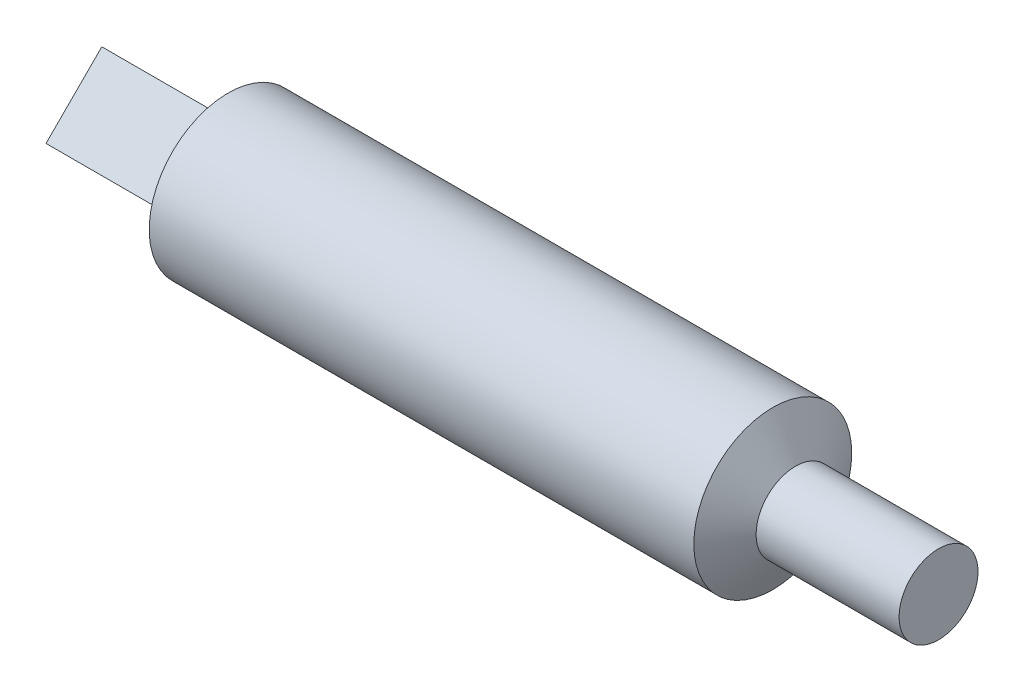
ISO-10303-21;
HEADER;
FILE_DESCRIPTION(('STEP AP214'),'2;1');
FILE_NAME('part.step','',(''),(''),'','','');
FILE_SCHEMA(('AUTOMOTIVE_DESIGN { 1 0 10303 214 1 1 1 1 }'));
ENDSEC;
DATA;
#1=APPLICATION_CONTEXT('core data for automotive mechanical design processes');
#2=APPLICATION_PROTOCOL_DEFINITION('international standard','automotive_design',2000,#1);
#3=PRODUCT_CONTEXT('',#1,'mechanical');
#4=PRODUCT('Part','Part','',(#3));
#5=PRODUCT_RELATED_PRODUCT_CATEGORY('part','',(#4));
#6=PRODUCT_DEFINITION_FORMATION('','',#4);
#7=PRODUCT_DEFINITION_CONTEXT('part definition',#1,'design');
#8=PRODUCT_DEFINITION('design','',#6,#7);
#9=PRODUCT_DEFINITION_SHAPE('','',#8);
#10=(LENGTH_UNIT() NAMED_UNIT(*) SI_UNIT(.MILLI.,.METRE.));
#11=(NAMED_UNIT(*) PLANE_ANGLE_UNIT() SI_UNIT($,.RADIAN.));
#12=(NAMED_UNIT(*) SI_UNIT($,.STERADIAN.) SOLID_ANGLE_UNIT());
#13=UNCERTAINTY_MEASURE_WITH_UNIT(LENGTH_MEASURE(1.E-05),#10,'distance_accuracy_value','');
#14=(GEOMETRIC_REPRESENTATION_CONTEXT(3) GLOBAL_UNCERTAINTY_ASSIGNED_CONTEXT((#13)) GLOBAL_UNIT_ASSIGNED_CONTEXT((#10,
#11,#12)) REPRESENTATION_CONTEXT('',''));
#15=CARTESIAN_POINT('',(0.,0.,0.));
#16=DIRECTION('',(0.,0.,1.));
#17=DIRECTION('',(1.,0.,0.));
#18=AXIS2_PLACEMENT_3D('',#15,#16,#17);
#19=CARTESIAN_POINT('',(0.,0.,0.));
#20=DIRECTION('',(1.,0.,0.));
#21=DIRECTION('',(0.,0.,-1.));
#22=AXIS2_PLACEMENT_3D('',#19,#20,#21);
#23=PLANE('',#22);
#24=CARTESIAN_POINT('',(0.,0.,0.));
#25=DIRECTION('',(1.,0.,0.));
#26=DIRECTION('',(0.,0.,-1.));
#27=AXIS2_PLACEMENT_3D('',#24,#25,#26);
#28=CIRCLE('',#27,5.);
#29=CARTESIAN_POINT('',(0.,0.,-5.));
#30=VERTEX_POINT('',#29);
#31=EDGE_CURVE('E108',#30,#30,#28,.T.);
#32=ORIENTED_EDGE('',*,*,#31,.F.);
#33=EDGE_LOOP('',(#32));
#34=FACE_BOUND('',#33,.T.);
#35=DIRECTION('',(0.,0.707106781186547,-0.707106781186548));
#36=VECTOR('',#35,1.);
#37=CARTESIAN_POINT('',(0.,0.,3.53553390593274));
#38=LINE('',#37,#36);
#39=CARTESIAN_POINT('',(0.,0.,3.53553390593274));
#40=VERTEX_POINT('',#39);
#41=CARTESIAN_POINT('',(0.,3.53553390593274,0.));
#42=VERTEX_POINT('',#41);
#43=EDGE_CURVE('E59',#40,#42,#38,.T.);
#44=ORIENTED_EDGE('',*,*,#43,.F.);
#45=DIRECTION('',(0.,0.707106781186548,0.707106781186547));
#46=VECTOR('',#45,1.);
#47=CARTESIAN_POINT('',(0.,-3.53553390593274,0.));
#48=LINE('',#47,#46);
#49=CARTESIAN_POINT('',(0.,-3.53553390593274,0.));
#50=VERTEX_POINT('',#49);
#51=EDGE_CURVE('E63',#50,#40,#48,.T.);
#52=ORIENTED_EDGE('',*,*,#51,.F.);
#53=DIRECTION('',(0.,-0.707106781186548,0.707106781186548));
#54=VECTOR('',#53,1.);
#55=CARTESIAN_POINT('',(0.,0.,-3.53553390593274));
#56=LINE('',#55,#54);
#57=CARTESIAN_POINT('',(0.,0.,-3.53553390593274));
#58=VERTEX_POINT('',#57);
#59=EDGE_CURVE('E222',#58,#50,#56,.T.);
#60=ORIENTED_EDGE('',*,*,#59,.F.);
#61=DIRECTION('',(0.,-0.707106781186548,-0.707106781186547));
#62=VECTOR('',#61,1.);
#63=CARTESIAN_POINT('',(0.,3.53553390593274,0.));
#64=LINE('',#63,#62);
#65=EDGE_CURVE('E224',#42,#58,#64,.T.);
#66=ORIENTED_EDGE('',*,*,#65,.F.);
#67=EDGE_LOOP('',(#44,#52,#60,#66));
#68=FACE_BOUND('',#67,.T.);
#69=ADVANCED_FACE('F43',(#34,#68),#23,.F.);
#70=CARTESIAN_POINT('',(37.,0.,0.));
#71=DIRECTION('',(-1.,0.,0.));
#72=DIRECTION('',(0.,0.,1.));
#73=AXIS2_PLACEMENT_3D('',#70,#71,#72);
#74=CYLINDRICAL_SURFACE('',#73,5.);
#75=CARTESIAN_POINT('',(34.5,0.,0.));
#76=DIRECTION('',(1.,0.,0.));
#77=DIRECTION('',(0.,0.,-1.));
#78=AXIS2_PLACEMENT_3D('',#75,#76,#77);
#79=CIRCLE('',#78,5.);
#80=CARTESIAN_POINT('',(34.5,0.,-5.));
#81=VERTEX_POINT('',#80);
#82=EDGE_CURVE('E52',#81,#81,#79,.F.);
#83=ORIENTED_EDGE('',*,*,#82,.T.);
#84=EDGE_LOOP('',(#83));
#85=FACE_BOUND('',#84,.T.);
#86=ORIENTED_EDGE('',*,*,#31,.T.);
#87=EDGE_LOOP('',(#86));
#88=FACE_BOUND('',#87,.T.);
#89=ADVANCED_FACE('F118',(#85,#88),#74,.T.);
#90=CARTESIAN_POINT('',(45.,0.,0.));
#91=DIRECTION('',(-1.,0.,0.));
#92=DIRECTION('',(0.,0.,1.));
#93=AXIS2_PLACEMENT_3D('',#90,#91,#92);
#94=CYLINDRICAL_SURFACE('',#93,2.5);
#95=CARTESIAN_POINT('',(35.943375672974,0.,0.));
#96=DIRECTION('',(-1.,0.,0.));
#97=DIRECTION('',(0.,0.,1.));
#98=AXIS2_PLACEMENT_3D('',#95,#96,#97);
#99=CIRCLE('',#98,2.5);
#100=CARTESIAN_POINT('',(35.943375672974,0.,2.5));
#101=VERTEX_POINT('',#100);
#102=EDGE_CURVE('E11',#101,#101,#99,.F.);
#103=ORIENTED_EDGE('',*,*,#102,.T.);
#104=EDGE_LOOP('',(#103));
#105=FACE_BOUND('',#104,.T.);
#106=CARTESIAN_POINT('',(45.,0.,0.));
#107=DIRECTION('',(1.,0.,0.));
#108=DIRECTION('',(0.,0.,-1.));
#109=AXIS2_PLACEMENT_3D('',#106,#107,#108);
#110=CIRCLE('',#109,2.5);
#111=CARTESIAN_POINT('',(45.,0.,-2.5));
#112=VERTEX_POINT('',#111);
#113=EDGE_CURVE('E105',#112,#112,#110,.T.);
#114=ORIENTED_EDGE('',*,*,#113,.F.);
#115=EDGE_LOOP('',(#114));
#116=FACE_BOUND('',#115,.T.);
#117=ADVANCED_FACE('F125',(#105,#116),#94,.T.);
#118=CARTESIAN_POINT('',(45.,0.,0.));
#119=DIRECTION('',(1.,0.,0.));
#120=DIRECTION('',(0.,0.,-1.));
#121=AXIS2_PLACEMENT_3D('',#118,#119,#120);
#122=PLANE('',#121);
#123=ORIENTED_EDGE('',*,*,#113,.T.);
#124=EDGE_LOOP('',(#123));
#125=FACE_BOUND('',#124,.T.);
#126=ADVANCED_FACE('F128',(#125),#122,.T.);
#127=CARTESIAN_POINT('',(-8.,0.,3.53553390593274));
#128=DIRECTION('',(0.,-0.707106781186548,-0.707106781186547));
#129=DIRECTION('',(0.,0.707106781186547,-0.707106781186548));
#130=AXIS2_PLACEMENT_3D('',#127,#128,#129);
#131=PLANE('',#130);
#132=ORIENTED_EDGE('',*,*,#43,.T.);
#133=DIRECTION('',(1.,0.,0.));
#134=VECTOR('',#133,1.);
#135=CARTESIAN_POINT('',(-8.,3.53553390593274,0.));
#136=LINE('',#135,#134);
#137=CARTESIAN_POINT('',(-8.,3.53553390593274,0.));
#138=VERTEX_POINT('',#137);
#139=EDGE_CURVE('E88',#138,#42,#136,.T.);
#140=ORIENTED_EDGE('',*,*,#139,.F.);
#141=DIRECTION('',(0.,0.707106781186547,-0.707106781186548));
#142=VECTOR('',#141,1.);
#143=CARTESIAN_POINT('',(-8.,0.,3.53553390593274));
#144=LINE('',#143,#142);
#145=CARTESIAN_POINT('',(-8.,0.,3.53553390593274));
#146=VERTEX_POINT('',#145);
#147=EDGE_CURVE('E94',#146,#138,#144,.T.);
#148=ORIENTED_EDGE('',*,*,#147,.F.);
#149=DIRECTION('',(1.,0.,0.));
#150=VECTOR('',#149,1.);
#151=CARTESIAN_POINT('',(-8.,0.,3.53553390593274));
#152=LINE('',#151,#150);
#153=EDGE_CURVE('E226',#146,#40,#152,.T.);
#154=ORIENTED_EDGE('',*,*,#153,.T.);
#155=EDGE_LOOP('',(#132,#140,#148,#154));
#156=FACE_BOUND('',#155,.T.);
#157=ADVANCED_FACE('F104',(#156),#131,.F.);
#158=CARTESIAN_POINT('',(-8.,3.53553390593274,0.));
#159=DIRECTION('',(0.,-0.707106781186547,0.707106781186548));
#160=DIRECTION('',(0.,-0.707106781186548,-0.707106781186547));
#161=AXIS2_PLACEMENT_3D('',#158,#159,#160);
#162=PLANE('',#161);
#163=ORIENTED_EDGE('',*,*,#65,.T.);
#164=DIRECTION('',(1.,0.,0.));
#165=VECTOR('',#164,1.);
#166=CARTESIAN_POINT('',(-8.,0.,-3.53553390593274));
#167=LINE('',#166,#165);
#168=CARTESIAN_POINT('',(-8.,0.,-3.53553390593274));
#169=VERTEX_POINT('',#168);
#170=EDGE_CURVE('E90',#169,#58,#167,.T.);
#171=ORIENTED_EDGE('',*,*,#170,.F.);
#172=DIRECTION('',(0.,-0.707106781186548,-0.707106781186547));
#173=VECTOR('',#172,1.);
#174=CARTESIAN_POINT('',(-8.,3.53553390593274,0.));
#175=LINE('',#174,#173);
#176=EDGE_CURVE('E83',#138,#169,#175,.T.);
#177=ORIENTED_EDGE('',*,*,#176,.F.);
#178=ORIENTED_EDGE('',*,*,#139,.T.);
#179=EDGE_LOOP('',(#163,#171,#177,#178));
#180=FACE_BOUND('',#179,.T.);
#181=ADVANCED_FACE('F86',(#180),#162,.F.);
#182=CARTESIAN_POINT('',(-8.,0.,-3.53553390593274));
#183=DIRECTION('',(0.,0.707106781186547,0.707106781186547));
#184=DIRECTION('',(0.,-0.707106781186548,0.707106781186548));
#185=AXIS2_PLACEMENT_3D('',#182,#183,#184);
#186=PLANE('',#185);
#187=ORIENTED_EDGE('',*,*,#59,.T.);
#188=DIRECTION('',(1.,0.,0.));
#189=VECTOR('',#188,1.);
#190=CARTESIAN_POINT('',(-8.,-3.53553390593274,0.));
#191=LINE('',#190,#189);
#192=CARTESIAN_POINT('',(-8.,-3.53553390593274,0.));
#193=VERTEX_POINT('',#192);
#194=EDGE_CURVE('E110',#193,#50,#191,.T.);
#195=ORIENTED_EDGE('',*,*,#194,.F.);
#196=DIRECTION('',(0.,-0.707106781186548,0.707106781186548));
#197=VECTOR('',#196,1.);
#198=CARTESIAN_POINT('',(-8.,0.,-3.53553390593274));
#199=LINE('',#198,#197);
#200=EDGE_CURVE('E93',#169,#193,#199,.T.);
#201=ORIENTED_EDGE('',*,*,#200,.F.);
#202=ORIENTED_EDGE('',*,*,#170,.T.);
#203=EDGE_LOOP('',(#187,#195,#201,#202));
#204=FACE_BOUND('',#203,.T.);
#205=ADVANCED_FACE('F176',(#204),#186,.F.);
#206=CARTESIAN_POINT('',(-8.,-3.53553390593274,0.));
#207=DIRECTION('',(0.,0.707106781186547,-0.707106781186548));
#208=DIRECTION('',(0.,0.707106781186548,0.707106781186547));
#209=AXIS2_PLACEMENT_3D('',#206,#207,#208);
#210=PLANE('',#209);
#211=ORIENTED_EDGE('',*,*,#51,.T.);
#212=ORIENTED_EDGE('',*,*,#153,.F.);
#213=DIRECTION('',(0.,0.707106781186548,0.707106781186547));
#214=VECTOR('',#213,1.);
#215=CARTESIAN_POINT('',(-8.,-3.53553390593274,0.));
#216=LINE('',#215,#214);
#217=EDGE_CURVE('E99',#193,#146,#216,.T.);
#218=ORIENTED_EDGE('',*,*,#217,.F.);
#219=ORIENTED_EDGE('',*,*,#194,.T.);
#220=EDGE_LOOP('',(#211,#212,#218,#219));
#221=FACE_BOUND('',#220,.T.);
#222=ADVANCED_FACE('F170',(#221),#210,.F.);
#223=CARTESIAN_POINT('',(-8.,0.,0.));
#224=DIRECTION('',(-1.,0.,0.));
#225=DIRECTION('',(0.,0.,1.));
#226=AXIS2_PLACEMENT_3D('',#223,#224,#225);
#227=PLANE('',#226);
#228=ORIENTED_EDGE('',*,*,#147,.T.);
#229=ORIENTED_EDGE('',*,*,#176,.T.);
#230=ORIENTED_EDGE('',*,*,#200,.T.);
#231=ORIENTED_EDGE('',*,*,#217,.T.);
#232=EDGE_LOOP('',(#228,#229,#230,#231));
#233=FACE_BOUND('',#232,.T.);
#234=ADVANCED_FACE('F97',(#233),#227,.T.);
#235=CARTESIAN_POINT('',(37.,0.,0.));
#236=DIRECTION('',(-1.,0.,0.));
#237=DIRECTION('',(0.,0.,1.));
#238=AXIS2_PLACEMENT_3D('',#235,#236,#237);
#239=CONICAL_SURFACE('',#238,0.669872981077712,1.0471975511966);
#240=ORIENTED_EDGE('',*,*,#82,.F.);
#241=EDGE_LOOP('',(#240));
#242=FACE_BOUND('',#241,.T.);
#243=ORIENTED_EDGE('',*,*,#102,.F.);
#244=EDGE_LOOP('',(#243));
#245=FACE_BOUND('',#244,.T.);
#246=ADVANCED_FACE('F46',(#242,#245),#239,.T.);
#247=CLOSED_SHELL('',(#69,#89,#117,#126,#157,#181,#205,#222,#234,#246));
#248=MANIFOLD_SOLID_BREP('B2',#247);
#249=ADVANCED_BREP_SHAPE_REPRESENTATION('',(#18,#248),#14);
#250=SHAPE_DEFINITION_REPRESENTATION(#9,#249);
ENDSEC;
END-ISO-10303-21;
